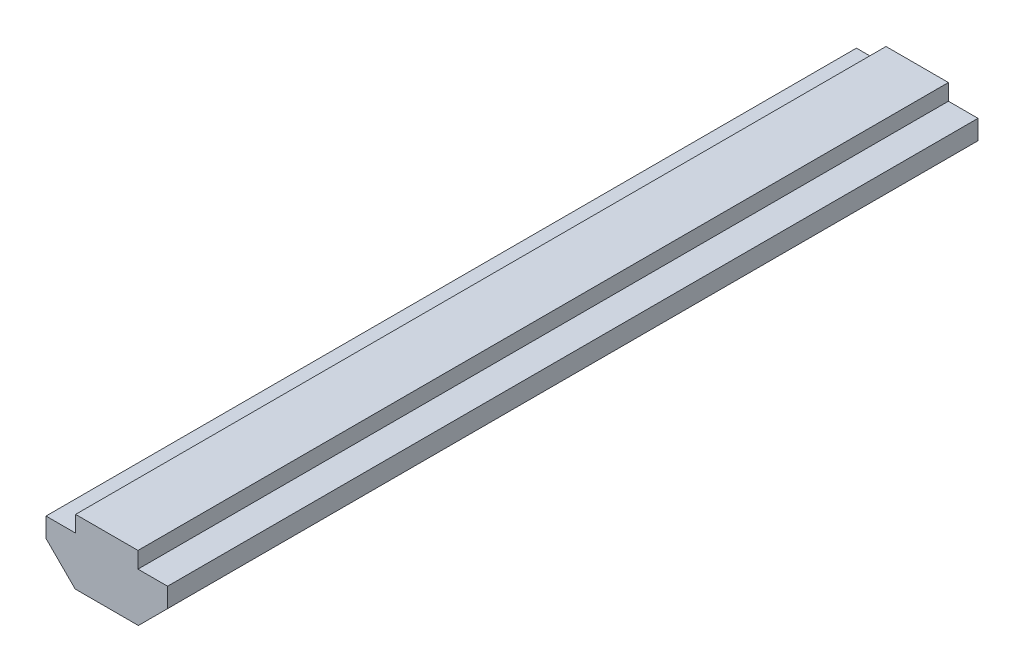
ISO-10303-21;
HEADER;
FILE_DESCRIPTION(('STEP AP214'),'2;1');
FILE_NAME('part.step','',(''),(''),'','','');
FILE_SCHEMA(('AUTOMOTIVE_DESIGN { 1 0 10303 214 1 1 1 1 }'));
ENDSEC;
DATA;
#1=APPLICATION_CONTEXT('core data for automotive mechanical design processes');
#2=APPLICATION_PROTOCOL_DEFINITION('international standard','automotive_design',2000,#1);
#3=PRODUCT_CONTEXT('',#1,'mechanical');
#4=PRODUCT('Part','Part','',(#3));
#5=PRODUCT_RELATED_PRODUCT_CATEGORY('part','',(#4));
#6=PRODUCT_DEFINITION_FORMATION('','',#4);
#7=PRODUCT_DEFINITION_CONTEXT('part definition',#1,'design');
#8=PRODUCT_DEFINITION('design','',#6,#7);
#9=PRODUCT_DEFINITION_SHAPE('','',#8);
#10=(LENGTH_UNIT() NAMED_UNIT(*) SI_UNIT(.MILLI.,.METRE.));
#11=(NAMED_UNIT(*) PLANE_ANGLE_UNIT() SI_UNIT($,.RADIAN.));
#12=(NAMED_UNIT(*) SI_UNIT($,.STERADIAN.) SOLID_ANGLE_UNIT());
#13=UNCERTAINTY_MEASURE_WITH_UNIT(LENGTH_MEASURE(1.E-05),#10,'distance_accuracy_value','');
#14=(GEOMETRIC_REPRESENTATION_CONTEXT(3) GLOBAL_UNCERTAINTY_ASSIGNED_CONTEXT((#13)) GLOBAL_UNIT_ASSIGNED_CONTEXT((#10,
#11,#12)) REPRESENTATION_CONTEXT('',''));
#15=CARTESIAN_POINT('',(0.,0.,0.));
#16=DIRECTION('',(0.,0.,1.));
#17=DIRECTION('',(1.,0.,0.));
#18=AXIS2_PLACEMENT_3D('',#15,#16,#17);
#19=CARTESIAN_POINT('',(3.59999999999991,-6.,100.));
#20=DIRECTION('',(0.,1.,0.));
#21=DIRECTION('',(0.,0.,1.));
#22=AXIS2_PLACEMENT_3D('',#19,#20,#21);
#23=PLANE('',#22);
#24=DIRECTION('',(1.,0.,0.));
#25=VECTOR('',#24,1.);
#26=CARTESIAN_POINT('',(3.59999999999991,-6.,0.));
#27=LINE('',#26,#25);
#28=CARTESIAN_POINT('',(3.59999999999991,-6.,0.));
#29=VERTEX_POINT('',#28);
#30=CARTESIAN_POINT('',(11.4000000000001,-6.,0.));
#31=VERTEX_POINT('',#30);
#32=EDGE_CURVE('E143',#29,#31,#27,.T.);
#33=ORIENTED_EDGE('',*,*,#32,.T.);
#34=DIRECTION('',(0.,0.,-1.));
#35=VECTOR('',#34,1.);
#36=CARTESIAN_POINT('',(11.4000000000001,-6.,100.));
#37=LINE('',#36,#35);
#38=CARTESIAN_POINT('',(11.4000000000001,-6.,100.));
#39=VERTEX_POINT('',#38);
#40=EDGE_CURVE('E11',#39,#31,#37,.T.);
#41=ORIENTED_EDGE('',*,*,#40,.F.);
#42=DIRECTION('',(1.,0.,0.));
#43=VECTOR('',#42,1.);
#44=CARTESIAN_POINT('',(3.59999999999991,-6.,100.));
#45=LINE('',#44,#43);
#46=CARTESIAN_POINT('',(3.59999999999991,-6.,100.));
#47=VERTEX_POINT('',#46);
#48=EDGE_CURVE('E161',#47,#39,#45,.T.);
#49=ORIENTED_EDGE('',*,*,#48,.F.);
#50=DIRECTION('',(0.,0.,-1.));
#51=VECTOR('',#50,1.);
#52=CARTESIAN_POINT('',(3.59999999999991,-6.,100.));
#53=LINE('',#52,#51);
#54=EDGE_CURVE('E139',#47,#29,#53,.T.);
#55=ORIENTED_EDGE('',*,*,#54,.T.);
#56=EDGE_LOOP('',(#33,#41,#49,#55));
#57=FACE_BOUND('',#56,.T.);
#58=ADVANCED_FACE('F35',(#57),#23,.F.);
#59=CARTESIAN_POINT('',(11.4000000000001,-6.,100.));
#60=DIRECTION('',(-0.707106781186536,0.707106781186559,0.));
#61=DIRECTION('',(-0.707106781186559,-0.707106781186536,0.));
#62=AXIS2_PLACEMENT_3D('',#59,#60,#61);
#63=PLANE('',#62);
#64=DIRECTION('',(0.707106781186559,0.707106781186536,0.));
#65=VECTOR('',#64,1.);
#66=CARTESIAN_POINT('',(11.4000000000001,-6.,0.));
#67=LINE('',#66,#65);
#68=CARTESIAN_POINT('',(15.,-2.4000000000002,0.));
#69=VERTEX_POINT('',#68);
#70=EDGE_CURVE('E146',#31,#69,#67,.T.);
#71=ORIENTED_EDGE('',*,*,#70,.T.);
#72=DIRECTION('',(0.,0.,-1.));
#73=VECTOR('',#72,1.);
#74=CARTESIAN_POINT('',(15.,-2.4000000000002,100.));
#75=LINE('',#74,#73);
#76=CARTESIAN_POINT('',(15.,-2.4000000000002,100.));
#77=VERTEX_POINT('',#76);
#78=EDGE_CURVE('E43',#77,#69,#75,.T.);
#79=ORIENTED_EDGE('',*,*,#78,.F.);
#80=DIRECTION('',(0.707106781186559,0.707106781186536,0.));
#81=VECTOR('',#80,1.);
#82=CARTESIAN_POINT('',(11.4000000000001,-6.,100.));
#83=LINE('',#82,#81);
#84=EDGE_CURVE('E100',#39,#77,#83,.T.);
#85=ORIENTED_EDGE('',*,*,#84,.F.);
#86=ORIENTED_EDGE('',*,*,#40,.T.);
#87=EDGE_LOOP('',(#71,#79,#85,#86));
#88=FACE_BOUND('',#87,.T.);
#89=ADVANCED_FACE('F210',(#88),#63,.F.);
#90=CARTESIAN_POINT('',(15.,-2.4000000000002,100.));
#91=DIRECTION('',(-1.,0.,0.));
#92=DIRECTION('',(0.,0.,1.));
#93=AXIS2_PLACEMENT_3D('',#90,#91,#92);
#94=PLANE('',#93);
#95=DIRECTION('',(0.,1.,0.));
#96=VECTOR('',#95,1.);
#97=CARTESIAN_POINT('',(15.,-2.4000000000002,0.));
#98=LINE('',#97,#96);
#99=CARTESIAN_POINT('',(15.,0.,0.));
#100=VERTEX_POINT('',#99);
#101=EDGE_CURVE('E148',#69,#100,#98,.T.);
#102=ORIENTED_EDGE('',*,*,#101,.T.);
#103=DIRECTION('',(0.,0.,-1.));
#104=VECTOR('',#103,1.);
#105=CARTESIAN_POINT('',(15.,0.,100.));
#106=LINE('',#105,#104);
#107=CARTESIAN_POINT('',(15.,0.,100.));
#108=VERTEX_POINT('',#107);
#109=EDGE_CURVE('E174',#108,#100,#106,.T.);
#110=ORIENTED_EDGE('',*,*,#109,.F.);
#111=DIRECTION('',(0.,1.,0.));
#112=VECTOR('',#111,1.);
#113=CARTESIAN_POINT('',(15.,-2.4000000000002,100.));
#114=LINE('',#113,#112);
#115=EDGE_CURVE('E182',#77,#108,#114,.T.);
#116=ORIENTED_EDGE('',*,*,#115,.F.);
#117=ORIENTED_EDGE('',*,*,#78,.T.);
#118=EDGE_LOOP('',(#102,#110,#116,#117));
#119=FACE_BOUND('',#118,.T.);
#120=ADVANCED_FACE('F180',(#119),#94,.F.);
#121=CARTESIAN_POINT('',(15.,0.,100.));
#122=DIRECTION('',(0.,-1.,0.));
#123=DIRECTION('',(0.,0.,-1.));
#124=AXIS2_PLACEMENT_3D('',#121,#122,#123);
#125=PLANE('',#124);
#126=DIRECTION('',(-1.,0.,0.));
#127=VECTOR('',#126,1.);
#128=CARTESIAN_POINT('',(15.,0.,0.));
#129=LINE('',#128,#127);
#130=CARTESIAN_POINT('',(11.3499999999999,0.,0.));
#131=VERTEX_POINT('',#130);
#132=EDGE_CURVE('E150',#100,#131,#129,.T.);
#133=ORIENTED_EDGE('',*,*,#132,.T.);
#134=DIRECTION('',(0.,0.,-1.));
#135=VECTOR('',#134,1.);
#136=CARTESIAN_POINT('',(11.3499999999999,0.,100.));
#137=LINE('',#136,#135);
#138=CARTESIAN_POINT('',(11.3499999999999,0.,100.));
#139=VERTEX_POINT('',#138);
#140=EDGE_CURVE('E171',#139,#131,#137,.T.);
#141=ORIENTED_EDGE('',*,*,#140,.F.);
#142=DIRECTION('',(-1.,0.,0.));
#143=VECTOR('',#142,1.);
#144=CARTESIAN_POINT('',(15.,0.,100.));
#145=LINE('',#144,#143);
#146=EDGE_CURVE('E200',#108,#139,#145,.T.);
#147=ORIENTED_EDGE('',*,*,#146,.F.);
#148=ORIENTED_EDGE('',*,*,#109,.T.);
#149=EDGE_LOOP('',(#133,#141,#147,#148));
#150=FACE_BOUND('',#149,.T.);
#151=ADVANCED_FACE('F191',(#150),#125,.F.);
#152=CARTESIAN_POINT('',(11.3499999999999,0.,100.));
#153=DIRECTION('',(-1.,0.,0.));
#154=DIRECTION('',(0.,0.,1.));
#155=AXIS2_PLACEMENT_3D('',#152,#153,#154);
#156=PLANE('',#155);
#157=DIRECTION('',(0.,1.,0.));
#158=VECTOR('',#157,1.);
#159=CARTESIAN_POINT('',(11.3499999999999,0.,0.));
#160=LINE('',#159,#158);
#161=CARTESIAN_POINT('',(11.3499999999999,2.,0.));
#162=VERTEX_POINT('',#161);
#163=EDGE_CURVE('E152',#131,#162,#160,.T.);
#164=ORIENTED_EDGE('',*,*,#163,.T.);
#165=DIRECTION('',(0.,0.,-1.));
#166=VECTOR('',#165,1.);
#167=CARTESIAN_POINT('',(11.3499999999999,2.,100.));
#168=LINE('',#167,#166);
#169=CARTESIAN_POINT('',(11.3499999999999,2.,100.));
#170=VERTEX_POINT('',#169);
#171=EDGE_CURVE('E168',#170,#162,#168,.T.);
#172=ORIENTED_EDGE('',*,*,#171,.F.);
#173=DIRECTION('',(0.,1.,0.));
#174=VECTOR('',#173,1.);
#175=CARTESIAN_POINT('',(11.3499999999999,0.,100.));
#176=LINE('',#175,#174);
#177=EDGE_CURVE('E197',#139,#170,#176,.T.);
#178=ORIENTED_EDGE('',*,*,#177,.F.);
#179=ORIENTED_EDGE('',*,*,#140,.T.);
#180=EDGE_LOOP('',(#164,#172,#178,#179));
#181=FACE_BOUND('',#180,.T.);
#182=ADVANCED_FACE('F195',(#181),#156,.F.);
#183=CARTESIAN_POINT('',(11.3499999999999,2.,100.));
#184=DIRECTION('',(0.,-1.,0.));
#185=DIRECTION('',(0.,0.,-1.));
#186=AXIS2_PLACEMENT_3D('',#183,#184,#185);
#187=PLANE('',#186);
#188=DIRECTION('',(-1.,0.,0.));
#189=VECTOR('',#188,1.);
#190=CARTESIAN_POINT('',(11.3499999999999,2.,0.));
#191=LINE('',#190,#189);
#192=CARTESIAN_POINT('',(3.65000000000009,2.,0.));
#193=VERTEX_POINT('',#192);
#194=EDGE_CURVE('E154',#162,#193,#191,.T.);
#195=ORIENTED_EDGE('',*,*,#194,.T.);
#196=DIRECTION('',(0.,0.,-1.));
#197=VECTOR('',#196,1.);
#198=CARTESIAN_POINT('',(3.65000000000009,2.,100.));
#199=LINE('',#198,#197);
#200=CARTESIAN_POINT('',(3.65000000000009,2.,100.));
#201=VERTEX_POINT('',#200);
#202=EDGE_CURVE('E165',#201,#193,#199,.T.);
#203=ORIENTED_EDGE('',*,*,#202,.F.);
#204=DIRECTION('',(-1.,0.,0.));
#205=VECTOR('',#204,1.);
#206=CARTESIAN_POINT('',(11.3499999999999,2.,100.));
#207=LINE('',#206,#205);
#208=EDGE_CURVE('E199',#170,#201,#207,.T.);
#209=ORIENTED_EDGE('',*,*,#208,.F.);
#210=ORIENTED_EDGE('',*,*,#171,.T.);
#211=EDGE_LOOP('',(#195,#203,#209,#210));
#212=FACE_BOUND('',#211,.T.);
#213=ADVANCED_FACE('F222',(#212),#187,.F.);
#214=CARTESIAN_POINT('',(3.65000000000009,2.,100.));
#215=DIRECTION('',(1.,0.,0.));
#216=DIRECTION('',(0.,0.,-1.));
#217=AXIS2_PLACEMENT_3D('',#214,#215,#216);
#218=PLANE('',#217);
#219=DIRECTION('',(0.,-1.,0.));
#220=VECTOR('',#219,1.);
#221=CARTESIAN_POINT('',(3.65000000000009,2.,0.));
#222=LINE('',#221,#220);
#223=CARTESIAN_POINT('',(3.65000000000009,0.,0.));
#224=VERTEX_POINT('',#223);
#225=EDGE_CURVE('E156',#193,#224,#222,.T.);
#226=ORIENTED_EDGE('',*,*,#225,.T.);
#227=DIRECTION('',(0.,0.,-1.));
#228=VECTOR('',#227,1.);
#229=CARTESIAN_POINT('',(3.65000000000009,0.,100.));
#230=LINE('',#229,#228);
#231=CARTESIAN_POINT('',(3.65000000000009,0.,100.));
#232=VERTEX_POINT('',#231);
#233=EDGE_CURVE('E134',#232,#224,#230,.T.);
#234=ORIENTED_EDGE('',*,*,#233,.F.);
#235=DIRECTION('',(0.,-1.,0.));
#236=VECTOR('',#235,1.);
#237=CARTESIAN_POINT('',(3.65000000000009,2.,100.));
#238=LINE('',#237,#236);
#239=EDGE_CURVE('E125',#201,#232,#238,.T.);
#240=ORIENTED_EDGE('',*,*,#239,.F.);
#241=ORIENTED_EDGE('',*,*,#202,.T.);
#242=EDGE_LOOP('',(#226,#234,#240,#241));
#243=FACE_BOUND('',#242,.T.);
#244=ADVANCED_FACE('F225',(#243),#218,.F.);
#245=CARTESIAN_POINT('',(3.65000000000009,0.,100.));
#246=DIRECTION('',(0.,-1.,0.));
#247=DIRECTION('',(0.,0.,-1.));
#248=AXIS2_PLACEMENT_3D('',#245,#246,#247);
#249=PLANE('',#248);
#250=DIRECTION('',(-1.,0.,0.));
#251=VECTOR('',#250,1.);
#252=CARTESIAN_POINT('',(3.65000000000009,0.,0.));
#253=LINE('',#252,#251);
#254=CARTESIAN_POINT('',(0.,0.,0.));
#255=VERTEX_POINT('',#254);
#256=EDGE_CURVE('E133',#224,#255,#253,.T.);
#257=ORIENTED_EDGE('',*,*,#256,.T.);
#258=DIRECTION('',(0.,0.,-1.));
#259=VECTOR('',#258,1.);
#260=CARTESIAN_POINT('',(0.,0.,100.));
#261=LINE('',#260,#259);
#262=CARTESIAN_POINT('',(0.,0.,100.));
#263=VERTEX_POINT('',#262);
#264=EDGE_CURVE('E130',#263,#255,#261,.T.);
#265=ORIENTED_EDGE('',*,*,#264,.F.);
#266=DIRECTION('',(-1.,0.,0.));
#267=VECTOR('',#266,1.);
#268=CARTESIAN_POINT('',(3.65000000000009,0.,100.));
#269=LINE('',#268,#267);
#270=EDGE_CURVE('E119',#232,#263,#269,.T.);
#271=ORIENTED_EDGE('',*,*,#270,.F.);
#272=ORIENTED_EDGE('',*,*,#233,.T.);
#273=EDGE_LOOP('',(#257,#265,#271,#272));
#274=FACE_BOUND('',#273,.T.);
#275=ADVANCED_FACE('F131',(#274),#249,.F.);
#276=CARTESIAN_POINT('',(0.,0.,100.));
#277=DIRECTION('',(1.,0.,0.));
#278=DIRECTION('',(0.,0.,-1.));
#279=AXIS2_PLACEMENT_3D('',#276,#277,#278);
#280=PLANE('',#279);
#281=DIRECTION('',(0.,-1.,0.));
#282=VECTOR('',#281,1.);
#283=CARTESIAN_POINT('',(0.,0.,0.));
#284=LINE('',#283,#282);
#285=CARTESIAN_POINT('',(0.,-2.4000000000002,0.));
#286=VERTEX_POINT('',#285);
#287=EDGE_CURVE('E86',#255,#286,#284,.T.);
#288=ORIENTED_EDGE('',*,*,#287,.T.);
#289=DIRECTION('',(0.,0.,-1.));
#290=VECTOR('',#289,1.);
#291=CARTESIAN_POINT('',(0.,-2.4000000000002,100.));
#292=LINE('',#291,#290);
#293=CARTESIAN_POINT('',(0.,-2.4000000000002,100.));
#294=VERTEX_POINT('',#293);
#295=EDGE_CURVE('E135',#294,#286,#292,.T.);
#296=ORIENTED_EDGE('',*,*,#295,.F.);
#297=DIRECTION('',(0.,-1.,0.));
#298=VECTOR('',#297,1.);
#299=CARTESIAN_POINT('',(0.,0.,100.));
#300=LINE('',#299,#298);
#301=EDGE_CURVE('E123',#263,#294,#300,.T.);
#302=ORIENTED_EDGE('',*,*,#301,.F.);
#303=ORIENTED_EDGE('',*,*,#264,.T.);
#304=EDGE_LOOP('',(#288,#296,#302,#303));
#305=FACE_BOUND('',#304,.T.);
#306=ADVANCED_FACE('F137',(#305),#280,.F.);
#307=CARTESIAN_POINT('',(0.,-2.4000000000002,100.));
#308=DIRECTION('',(0.707106781186536,0.707106781186559,0.));
#309=DIRECTION('',(-0.707106781186559,0.707106781186536,0.));
#310=AXIS2_PLACEMENT_3D('',#307,#308,#309);
#311=PLANE('',#310);
#312=DIRECTION('',(0.707106781186559,-0.707106781186536,0.));
#313=VECTOR('',#312,1.);
#314=CARTESIAN_POINT('',(0.,-2.4000000000002,0.));
#315=LINE('',#314,#313);
#316=EDGE_CURVE('E92',#286,#29,#315,.T.);
#317=ORIENTED_EDGE('',*,*,#316,.T.);
#318=ORIENTED_EDGE('',*,*,#54,.F.);
#319=DIRECTION('',(0.707106781186559,-0.707106781186536,0.));
#320=VECTOR('',#319,1.);
#321=CARTESIAN_POINT('',(0.,-2.4000000000002,100.));
#322=LINE('',#321,#320);
#323=EDGE_CURVE('E51',#294,#47,#322,.T.);
#324=ORIENTED_EDGE('',*,*,#323,.F.);
#325=ORIENTED_EDGE('',*,*,#295,.T.);
#326=EDGE_LOOP('',(#317,#318,#324,#325));
#327=FACE_BOUND('',#326,.T.);
#328=ADVANCED_FACE('F234',(#327),#311,.F.);
#329=CARTESIAN_POINT('',(0.,0.,100.));
#330=DIRECTION('',(0.,0.,1.));
#331=DIRECTION('',(1.,0.,0.));
#332=AXIS2_PLACEMENT_3D('',#329,#330,#331);
#333=PLANE('',#332);
#334=ORIENTED_EDGE('',*,*,#48,.T.);
#335=ORIENTED_EDGE('',*,*,#84,.T.);
#336=ORIENTED_EDGE('',*,*,#115,.T.);
#337=ORIENTED_EDGE('',*,*,#146,.T.);
#338=ORIENTED_EDGE('',*,*,#177,.T.);
#339=ORIENTED_EDGE('',*,*,#208,.T.);
#340=ORIENTED_EDGE('',*,*,#239,.T.);
#341=ORIENTED_EDGE('',*,*,#270,.T.);
#342=ORIENTED_EDGE('',*,*,#301,.T.);
#343=ORIENTED_EDGE('',*,*,#323,.T.);
#344=EDGE_LOOP('',(#334,#335,#336,#337,#338,#339,#340,#341,#342,#343));
#345=FACE_BOUND('',#344,.T.);
#346=ADVANCED_FACE('F121',(#345),#333,.T.);
#347=CARTESIAN_POINT('',(0.,0.,0.));
#348=DIRECTION('',(0.,0.,1.));
#349=DIRECTION('',(1.,0.,0.));
#350=AXIS2_PLACEMENT_3D('',#347,#348,#349);
#351=PLANE('',#350);
#352=ORIENTED_EDGE('',*,*,#32,.F.);
#353=ORIENTED_EDGE('',*,*,#316,.F.);
#354=ORIENTED_EDGE('',*,*,#287,.F.);
#355=ORIENTED_EDGE('',*,*,#256,.F.);
#356=ORIENTED_EDGE('',*,*,#225,.F.);
#357=ORIENTED_EDGE('',*,*,#194,.F.);
#358=ORIENTED_EDGE('',*,*,#163,.F.);
#359=ORIENTED_EDGE('',*,*,#132,.F.);
#360=ORIENTED_EDGE('',*,*,#101,.F.);
#361=ORIENTED_EDGE('',*,*,#70,.F.);
#362=EDGE_LOOP('',(#352,#353,#354,#355,#356,#357,#358,#359,#360,#361));
#363=FACE_BOUND('',#362,.T.);
#364=ADVANCED_FACE('F186',(#363),#351,.F.);
#365=CLOSED_SHELL('',(#58,#89,#120,#151,#182,#213,#244,#275,#306,#328,#346,#364));
#366=MANIFOLD_SOLID_BREP('B2',#365);
#367=ADVANCED_BREP_SHAPE_REPRESENTATION('',(#18,#366),#14);
#368=SHAPE_DEFINITION_REPRESENTATION(#9,#367);
ENDSEC;
END-ISO-10303-21;
